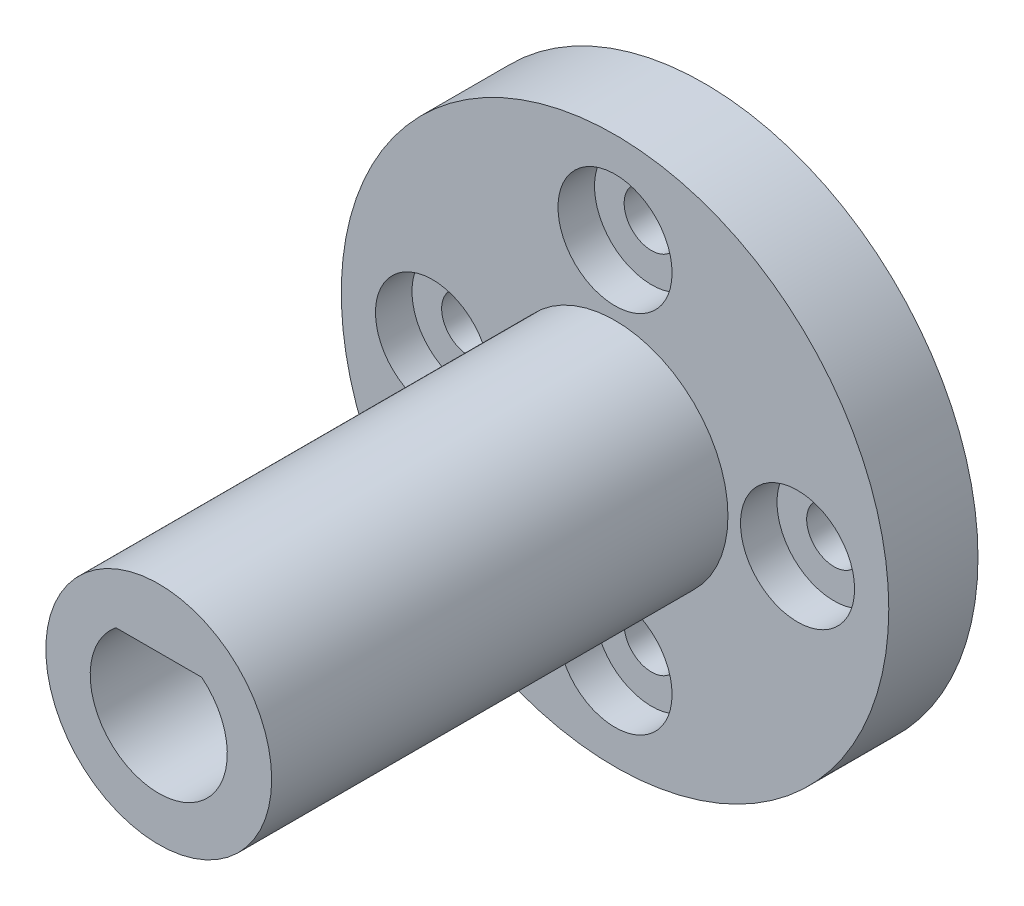
ISO-10303-21;
HEADER;
FILE_DESCRIPTION(('STEP AP214'),'2;1');
FILE_NAME('part.step','',(''),(''),'','','');
FILE_SCHEMA(('AUTOMOTIVE_DESIGN { 1 0 10303 214 1 1 1 1 }'));
ENDSEC;
DATA;
#1=APPLICATION_CONTEXT('core data for automotive mechanical design processes');
#2=APPLICATION_PROTOCOL_DEFINITION('international standard','automotive_design',2000,#1);
#3=PRODUCT_CONTEXT('',#1,'mechanical');
#4=PRODUCT('Part','Part','',(#3));
#5=PRODUCT_RELATED_PRODUCT_CATEGORY('part','',(#4));
#6=PRODUCT_DEFINITION_FORMATION('','',#4);
#7=PRODUCT_DEFINITION_CONTEXT('part definition',#1,'design');
#8=PRODUCT_DEFINITION('design','',#6,#7);
#9=PRODUCT_DEFINITION_SHAPE('','',#8);
#10=(LENGTH_UNIT() NAMED_UNIT(*) SI_UNIT(.MILLI.,.METRE.));
#11=(NAMED_UNIT(*) PLANE_ANGLE_UNIT() SI_UNIT($,.RADIAN.));
#12=(NAMED_UNIT(*) SI_UNIT($,.STERADIAN.) SOLID_ANGLE_UNIT());
#13=UNCERTAINTY_MEASURE_WITH_UNIT(LENGTH_MEASURE(1.E-05),#10,'distance_accuracy_value','');
#14=(GEOMETRIC_REPRESENTATION_CONTEXT(3) GLOBAL_UNCERTAINTY_ASSIGNED_CONTEXT((#13)) GLOBAL_UNIT_ASSIGNED_CONTEXT((#10,
#11,#12)) REPRESENTATION_CONTEXT('',''));
#15=CARTESIAN_POINT('',(0.,0.,0.));
#16=DIRECTION('',(0.,0.,1.));
#17=DIRECTION('',(1.,0.,0.));
#18=AXIS2_PLACEMENT_3D('',#15,#16,#17);
#19=CARTESIAN_POINT('',(0.,0.,3.91));
#20=DIRECTION('',(0.,0.,-1.));
#21=DIRECTION('',(-1.,0.,0.));
#22=AXIS2_PLACEMENT_3D('',#19,#20,#21);
#23=CYLINDRICAL_SURFACE('',#22,12.);
#24=CARTESIAN_POINT('',(0.,0.,3.91));
#25=DIRECTION('',(0.,0.,1.));
#26=DIRECTION('',(1.,0.,0.));
#27=AXIS2_PLACEMENT_3D('',#24,#25,#26);
#28=CIRCLE('',#27,12.);
#29=CARTESIAN_POINT('',(12.,0.,3.91));
#30=VERTEX_POINT('',#29);
#31=EDGE_CURVE('E11',#30,#30,#28,.T.);
#32=ORIENTED_EDGE('',*,*,#31,.F.);
#33=EDGE_LOOP('',(#32));
#34=FACE_BOUND('',#33,.T.);
#35=CARTESIAN_POINT('',(0.,0.,0.));
#36=DIRECTION('',(0.,0.,1.));
#37=DIRECTION('',(1.,0.,0.));
#38=AXIS2_PLACEMENT_3D('',#35,#36,#37);
#39=CIRCLE('',#38,12.);
#40=CARTESIAN_POINT('',(12.,0.,0.));
#41=VERTEX_POINT('',#40);
#42=EDGE_CURVE('E40',#41,#41,#39,.T.);
#43=ORIENTED_EDGE('',*,*,#42,.T.);
#44=EDGE_LOOP('',(#43));
#45=FACE_BOUND('',#44,.T.);
#46=ADVANCED_FACE('F37',(#34,#45),#23,.T.);
#47=CARTESIAN_POINT('',(0.,0.,3.91));
#48=DIRECTION('',(0.,0.,1.));
#49=DIRECTION('',(1.,0.,0.));
#50=AXIS2_PLACEMENT_3D('',#47,#48,#49);
#51=PLANE('',#50);
#52=CARTESIAN_POINT('',(8.,0.,3.91));
#53=DIRECTION('',(0.,0.,1.));
#54=DIRECTION('',(1.,0.,0.));
#55=AXIS2_PLACEMENT_3D('',#52,#53,#54);
#56=CIRCLE('',#55,2.5);
#57=CARTESIAN_POINT('',(10.5,0.,3.91));
#58=VERTEX_POINT('',#57);
#59=EDGE_CURVE('E307',#58,#58,#56,.T.);
#60=ORIENTED_EDGE('',*,*,#59,.F.);
#61=EDGE_LOOP('',(#60));
#62=FACE_BOUND('',#61,.T.);
#63=CARTESIAN_POINT('',(0.,-8.,3.91));
#64=DIRECTION('',(0.,0.,1.));
#65=DIRECTION('',(1.,0.,0.));
#66=AXIS2_PLACEMENT_3D('',#63,#64,#65);
#67=CIRCLE('',#66,2.5);
#68=CARTESIAN_POINT('',(2.5,-8.,3.91));
#69=VERTEX_POINT('',#68);
#70=EDGE_CURVE('E317',#69,#69,#67,.T.);
#71=ORIENTED_EDGE('',*,*,#70,.F.);
#72=EDGE_LOOP('',(#71));
#73=FACE_BOUND('',#72,.T.);
#74=CARTESIAN_POINT('',(-8.,0.,3.91));
#75=DIRECTION('',(0.,0.,1.));
#76=DIRECTION('',(1.,0.,0.));
#77=AXIS2_PLACEMENT_3D('',#74,#75,#76);
#78=CIRCLE('',#77,2.5);
#79=CARTESIAN_POINT('',(-5.50000000000001,0.,3.91));
#80=VERTEX_POINT('',#79);
#81=EDGE_CURVE('E329',#80,#80,#78,.T.);
#82=ORIENTED_EDGE('',*,*,#81,.F.);
#83=EDGE_LOOP('',(#82));
#84=FACE_BOUND('',#83,.T.);
#85=CARTESIAN_POINT('',(0.,8.,3.91));
#86=DIRECTION('',(0.,0.,1.));
#87=DIRECTION('',(1.,0.,0.));
#88=AXIS2_PLACEMENT_3D('',#85,#86,#87);
#89=CIRCLE('',#88,2.5);
#90=CARTESIAN_POINT('',(2.5,8.,3.91));
#91=VERTEX_POINT('',#90);
#92=EDGE_CURVE('E341',#91,#91,#89,.T.);
#93=ORIENTED_EDGE('',*,*,#92,.F.);
#94=EDGE_LOOP('',(#93));
#95=FACE_BOUND('',#94,.T.);
#96=CARTESIAN_POINT('',(0.,0.,3.91));
#97=DIRECTION('',(0.,0.,1.));
#98=DIRECTION('',(1.,0.,0.));
#99=AXIS2_PLACEMENT_3D('',#96,#97,#98);
#100=CIRCLE('',#99,4.95);
#101=CARTESIAN_POINT('',(4.95,0.,3.91));
#102=VERTEX_POINT('',#101);
#103=EDGE_CURVE('E77',#102,#102,#100,.T.);
#104=ORIENTED_EDGE('',*,*,#103,.F.);
#105=EDGE_LOOP('',(#104));
#106=FACE_BOUND('',#105,.T.);
#107=ORIENTED_EDGE('',*,*,#31,.T.);
#108=EDGE_LOOP('',(#107));
#109=FACE_BOUND('',#108,.T.);
#110=ADVANCED_FACE('F96',(#62,#73,#84,#95,#106,#109),#51,.T.);
#111=CARTESIAN_POINT('',(0.,0.,0.));
#112=DIRECTION('',(0.,0.,1.));
#113=DIRECTION('',(1.,0.,0.));
#114=AXIS2_PLACEMENT_3D('',#111,#112,#113);
#115=PLANE('',#114);
#116=CARTESIAN_POINT('',(8.,0.,0.));
#117=DIRECTION('',(0.,0.,1.));
#118=DIRECTION('',(1.,0.,0.));
#119=AXIS2_PLACEMENT_3D('',#116,#117,#118);
#120=CIRCLE('',#119,1.2);
#121=CARTESIAN_POINT('',(9.2,0.,0.));
#122=VERTEX_POINT('',#121);
#123=EDGE_CURVE('E314',#122,#122,#120,.T.);
#124=ORIENTED_EDGE('',*,*,#123,.T.);
#125=EDGE_LOOP('',(#124));
#126=FACE_BOUND('',#125,.T.);
#127=CARTESIAN_POINT('',(0.,-8.,0.));
#128=DIRECTION('',(0.,0.,1.));
#129=DIRECTION('',(1.,0.,0.));
#130=AXIS2_PLACEMENT_3D('',#127,#128,#129);
#131=CIRCLE('',#130,1.2);
#132=CARTESIAN_POINT('',(1.2,-8.,0.));
#133=VERTEX_POINT('',#132);
#134=EDGE_CURVE('E326',#133,#133,#131,.T.);
#135=ORIENTED_EDGE('',*,*,#134,.T.);
#136=EDGE_LOOP('',(#135));
#137=FACE_BOUND('',#136,.T.);
#138=CARTESIAN_POINT('',(-8.,0.,0.));
#139=DIRECTION('',(0.,0.,1.));
#140=DIRECTION('',(1.,0.,0.));
#141=AXIS2_PLACEMENT_3D('',#138,#139,#140);
#142=CIRCLE('',#141,1.2);
#143=CARTESIAN_POINT('',(-6.8,0.,0.));
#144=VERTEX_POINT('',#143);
#145=EDGE_CURVE('E338',#144,#144,#142,.T.);
#146=ORIENTED_EDGE('',*,*,#145,.T.);
#147=EDGE_LOOP('',(#146));
#148=FACE_BOUND('',#147,.T.);
#149=CARTESIAN_POINT('',(0.,8.,0.));
#150=DIRECTION('',(0.,0.,1.));
#151=DIRECTION('',(1.,0.,0.));
#152=AXIS2_PLACEMENT_3D('',#149,#150,#151);
#153=CIRCLE('',#152,1.2);
#154=CARTESIAN_POINT('',(1.2,8.,0.));
#155=VERTEX_POINT('',#154);
#156=EDGE_CURVE('E67',#155,#155,#153,.T.);
#157=ORIENTED_EDGE('',*,*,#156,.T.);
#158=EDGE_LOOP('',(#157));
#159=FACE_BOUND('',#158,.T.);
#160=CARTESIAN_POINT('',(0.,0.,0.));
#161=DIRECTION('',(0.,0.,-1.));
#162=DIRECTION('',(-1.,0.,0.));
#163=AXIS2_PLACEMENT_3D('',#160,#161,#162);
#164=CIRCLE('',#163,4.);
#165=CARTESIAN_POINT('',(-4.,0.,0.));
#166=VERTEX_POINT('',#165);
#167=EDGE_CURVE('E84',#166,#166,#164,.T.);
#168=ORIENTED_EDGE('',*,*,#167,.F.);
#169=EDGE_LOOP('',(#168));
#170=FACE_BOUND('',#169,.T.);
#171=ORIENTED_EDGE('',*,*,#42,.F.);
#172=EDGE_LOOP('',(#171));
#173=FACE_BOUND('',#172,.T.);
#174=ADVANCED_FACE('F93',(#126,#137,#148,#159,#170,#173),#115,.F.);
#175=CARTESIAN_POINT('',(0.,0.,1.91));
#176=DIRECTION('',(0.,0.,-1.));
#177=DIRECTION('',(-1.,0.,0.));
#178=AXIS2_PLACEMENT_3D('',#175,#176,#177);
#179=CYLINDRICAL_SURFACE('',#178,4.);
#180=CARTESIAN_POINT('',(0.,0.,1.91));
#181=DIRECTION('',(0.,0.,-1.));
#182=DIRECTION('',(-1.,0.,0.));
#183=AXIS2_PLACEMENT_3D('',#180,#181,#182);
#184=CIRCLE('',#183,4.);
#185=CARTESIAN_POINT('',(-4.,0.,1.91));
#186=VERTEX_POINT('',#185);
#187=EDGE_CURVE('E85',#186,#186,#184,.T.);
#188=CARTESIAN_POINT('',(-4.,0.,1.91));
#189=CARTESIAN_POINT('',(-4.,0.,1.89010416666667));
#190=CARTESIAN_POINT('',(-4.,0.,1.87020833333333));
#191=CARTESIAN_POINT('',(-4.,0.,1.83041666666667));
#192=CARTESIAN_POINT('',(-4.,0.,1.81052083333333));
#193=CARTESIAN_POINT('',(-4.,0.,1.77072916666667));
#194=CARTESIAN_POINT('',(-4.,0.,1.75083333333333));
#195=CARTESIAN_POINT('',(-4.,0.,1.71104166666667));
#196=CARTESIAN_POINT('',(-4.,0.,1.69114583333333));
#197=CARTESIAN_POINT('',(-4.,0.,1.65135416666667));
#198=CARTESIAN_POINT('',(-4.,0.,1.63145833333333));
#199=CARTESIAN_POINT('',(-4.,0.,1.59166666666667));
#200=CARTESIAN_POINT('',(-4.,0.,1.57177083333333));
#201=CARTESIAN_POINT('',(-4.,0.,1.53197916666667));
#202=CARTESIAN_POINT('',(-4.,0.,1.51208333333333));
#203=CARTESIAN_POINT('',(-4.,0.,1.47229166666667));
#204=CARTESIAN_POINT('',(-4.,0.,1.45239583333333));
#205=CARTESIAN_POINT('',(-4.,0.,1.41260416666667));
#206=CARTESIAN_POINT('',(-4.,0.,1.39270833333333));
#207=CARTESIAN_POINT('',(-4.,0.,1.35291666666667));
#208=CARTESIAN_POINT('',(-4.,0.,1.33302083333333));
#209=CARTESIAN_POINT('',(-4.,0.,1.29322916666667));
#210=CARTESIAN_POINT('',(-4.,0.,1.27333333333333));
#211=CARTESIAN_POINT('',(-4.,0.,1.23354166666667));
#212=CARTESIAN_POINT('',(-4.,0.,1.21364583333333));
#213=CARTESIAN_POINT('',(-4.,0.,1.17385416666667));
#214=CARTESIAN_POINT('',(-4.,0.,1.15395833333333));
#215=CARTESIAN_POINT('',(-4.,0.,1.11416666666667));
#216=CARTESIAN_POINT('',(-4.,0.,1.09427083333333));
#217=CARTESIAN_POINT('',(-4.,0.,1.05447916666667));
#218=CARTESIAN_POINT('',(-4.,0.,1.03458333333333));
#219=CARTESIAN_POINT('',(-4.,0.,0.994791666666667));
#220=CARTESIAN_POINT('',(-4.,0.,0.974895833333334));
#221=CARTESIAN_POINT('',(-4.,0.,0.935104166666667));
#222=CARTESIAN_POINT('',(-4.,0.,0.915208333333333));
#223=CARTESIAN_POINT('',(-4.,0.,0.875416666666667));
#224=CARTESIAN_POINT('',(-4.,0.,0.855520833333333));
#225=CARTESIAN_POINT('',(-4.,0.,0.815729166666667));
#226=CARTESIAN_POINT('',(-4.,0.,0.795833333333333));
#227=CARTESIAN_POINT('',(-4.,0.,0.756041666666667));
#228=CARTESIAN_POINT('',(-4.,0.,0.736145833333333));
#229=CARTESIAN_POINT('',(-4.,0.,0.696354166666667));
#230=CARTESIAN_POINT('',(-4.,0.,0.676458333333333));
#231=CARTESIAN_POINT('',(-4.,0.,0.636666666666667));
#232=CARTESIAN_POINT('',(-4.,0.,0.616770833333333));
#233=CARTESIAN_POINT('',(-4.,0.,0.576979166666667));
#234=CARTESIAN_POINT('',(-4.,0.,0.557083333333333));
#235=CARTESIAN_POINT('',(-4.,0.,0.517291666666667));
#236=CARTESIAN_POINT('',(-4.,0.,0.497395833333333));
#237=CARTESIAN_POINT('',(-4.,0.,0.457604166666667));
#238=CARTESIAN_POINT('',(-4.,0.,0.437708333333333));
#239=CARTESIAN_POINT('',(-4.,0.,0.397916666666667));
#240=CARTESIAN_POINT('',(-4.,0.,0.378020833333333));
#241=CARTESIAN_POINT('',(-4.,0.,0.338229166666667));
#242=CARTESIAN_POINT('',(-4.,0.,0.318333333333333));
#243=CARTESIAN_POINT('',(-4.,0.,0.278541666666667));
#244=CARTESIAN_POINT('',(-4.,0.,0.258645833333333));
#245=CARTESIAN_POINT('',(-4.,0.,0.218854166666667));
#246=CARTESIAN_POINT('',(-4.,0.,0.198958333333333));
#247=CARTESIAN_POINT('',(-4.,0.,0.159166666666667));
#248=CARTESIAN_POINT('',(-4.,0.,0.139270833333333));
#249=CARTESIAN_POINT('',(-4.,0.,0.0994791666666668));
#250=CARTESIAN_POINT('',(-4.,0.,0.0795833333333334));
#251=CARTESIAN_POINT('',(-4.,0.,0.0397916666666667));
#252=CARTESIAN_POINT('',(-4.,0.,0.0198958333333334));
#253=CARTESIAN_POINT('',(-4.,0.,0.));
#254=B_SPLINE_CURVE_WITH_KNOTS('',3,(#188,#189,#190,#191,#192,#193,#194,#195,#196,#197,#198,
#199,#200,#201,#202,#203,#204,#205,#206,#207,#208,#209,#210,#211,#212,#213,#214,#215,#216,#217,
#218,#219,#220,#221,#222,#223,#224,#225,#226,#227,#228,#229,#230,#231,#232,#233,#234,#235,#236,
#237,#238,#239,#240,#241,#242,#243,#244,#245,#246,#247,#248,#249,#250,#251,#252,#253),
.UNSPECIFIED.,.F.,.F.,(4,2,2,2,2,2,2,2,2,2,2,2,2,2,2,2,2,2,2,2,2,2,2,2,2,2,2,2,2,2,2,2,4),(0.,
0.0596874999999998,0.119375,0.1790625,0.23875,0.2984375,0.358125,0.4178125,0.4775,0.5371875,
0.596875,0.6565625,0.71625,0.7759375,0.835625,0.8953125,0.955,1.0146875,1.074375,1.1340625,
1.19375,1.2534375,1.313125,1.3728125,1.4325,1.4921875,1.551875,1.6115625,1.67125,1.7309375,
1.790625,1.8503125,1.91),.UNSPECIFIED.);
#255=EDGE_CURVE('BSEAM91',#186,#166,#254,.T.);
#256=ORIENTED_EDGE('',*,*,#187,.F.);
#257=ORIENTED_EDGE('',*,*,#167,.T.);
#258=ORIENTED_EDGE('',*,*,#255,.T.);
#259=ORIENTED_EDGE('',*,*,#255,.F.);
#260=EDGE_LOOP('',(#256,#258,#257,#259));
#261=FACE_BOUND('',#260,.T.);
#262=ADVANCED_FACE('F91',(#261),#179,.F.);
#263=CARTESIAN_POINT('',(0.,0.,1.91));
#264=DIRECTION('',(0.,0.,-1.));
#265=DIRECTION('',(-1.,0.,0.));
#266=AXIS2_PLACEMENT_3D('',#263,#264,#265);
#267=PLANE('',#266);
#268=ORIENTED_EDGE('',*,*,#187,.T.);
#269=EDGE_LOOP('',(#268));
#270=FACE_BOUND('',#269,.T.);
#271=ADVANCED_FACE('F140',(#270),#267,.T.);
#272=CARTESIAN_POINT('',(0.,2.345,23.91));
#273=DIRECTION('',(0.,-1.,0.));
#274=DIRECTION('',(0.,0.,-1.));
#275=AXIS2_PLACEMENT_3D('',#272,#273,#274);
#276=PLANE('',#275);
#277=DIRECTION('',(-1.,0.,0.));
#278=VECTOR('',#277,1.);
#279=CARTESIAN_POINT('',(0.,2.345,3.91));
#280=LINE('',#279,#278);
#281=CARTESIAN_POINT('',(1.87909552710872,2.345,3.91));
#282=VERTEX_POINT('',#281);
#283=CARTESIAN_POINT('',(-1.87909552710872,2.345,3.91));
#284=VERTEX_POINT('',#283);
#285=EDGE_CURVE('E64',#282,#284,#280,.T.);
#286=ORIENTED_EDGE('',*,*,#285,.F.);
#287=DIRECTION('',(0.,0.,-1.));
#288=VECTOR('',#287,1.);
#289=CARTESIAN_POINT('',(1.87909552710872,2.345,23.91));
#290=LINE('',#289,#288);
#291=CARTESIAN_POINT('',(1.87909552710872,2.345,23.91));
#292=VERTEX_POINT('',#291);
#293=EDGE_CURVE('E73',#292,#282,#290,.T.);
#294=ORIENTED_EDGE('',*,*,#293,.F.);
#295=DIRECTION('',(-1.,0.,0.));
#296=VECTOR('',#295,1.);
#297=CARTESIAN_POINT('',(0.,2.345,23.91));
#298=LINE('',#297,#296);
#299=CARTESIAN_POINT('',(-1.87909552710872,2.345,23.91));
#300=VERTEX_POINT('',#299);
#301=EDGE_CURVE('E71',#292,#300,#298,.T.);
#302=ORIENTED_EDGE('',*,*,#301,.T.);
#303=DIRECTION('',(0.,0.,-1.));
#304=VECTOR('',#303,1.);
#305=CARTESIAN_POINT('',(-1.87909552710872,2.345,23.91));
#306=LINE('',#305,#304);
#307=EDGE_CURVE('E58',#300,#284,#306,.T.);
#308=ORIENTED_EDGE('',*,*,#307,.T.);
#309=EDGE_LOOP('',(#286,#294,#302,#308));
#310=FACE_BOUND('',#309,.T.);
#311=ADVANCED_FACE('F69',(#310),#276,.T.);
#312=CARTESIAN_POINT('',(0.,0.,23.91));
#313=DIRECTION('',(0.,0.,-1.));
#314=DIRECTION('',(-1.,0.,0.));
#315=AXIS2_PLACEMENT_3D('',#312,#313,#314);
#316=CYLINDRICAL_SURFACE('',#315,3.005);
#317=CARTESIAN_POINT('',(0.,0.,3.91));
#318=DIRECTION('',(0.,0.,1.));
#319=DIRECTION('',(1.,0.,0.));
#320=AXIS2_PLACEMENT_3D('',#317,#318,#319);
#321=CIRCLE('',#320,3.005);
#322=EDGE_CURVE('E50',#284,#282,#321,.T.);
#323=ORIENTED_EDGE('',*,*,#322,.F.);
#324=ORIENTED_EDGE('',*,*,#307,.F.);
#325=CARTESIAN_POINT('',(0.,0.,23.91));
#326=DIRECTION('',(0.,0.,1.));
#327=DIRECTION('',(1.,0.,0.));
#328=AXIS2_PLACEMENT_3D('',#325,#326,#327);
#329=CIRCLE('',#328,3.005);
#330=EDGE_CURVE('E353',#300,#292,#329,.T.);
#331=ORIENTED_EDGE('',*,*,#330,.T.);
#332=ORIENTED_EDGE('',*,*,#293,.T.);
#333=EDGE_LOOP('',(#323,#324,#331,#332));
#334=FACE_BOUND('',#333,.T.);
#335=ADVANCED_FACE('F76',(#334),#316,.F.);
#336=CARTESIAN_POINT('',(0.,0.,23.91));
#337=DIRECTION('',(0.,0.,-1.));
#338=DIRECTION('',(-1.,0.,0.));
#339=AXIS2_PLACEMENT_3D('',#336,#337,#338);
#340=CYLINDRICAL_SURFACE('',#339,4.95);
#341=CARTESIAN_POINT('',(0.,0.,23.91));
#342=DIRECTION('',(0.,0.,1.));
#343=DIRECTION('',(1.,0.,0.));
#344=AXIS2_PLACEMENT_3D('',#341,#342,#343);
#345=CIRCLE('',#344,4.95);
#346=CARTESIAN_POINT('',(4.95,0.,23.91));
#347=VERTEX_POINT('',#346);
#348=EDGE_CURVE('E74',#347,#347,#345,.T.);
#349=ORIENTED_EDGE('',*,*,#348,.F.);
#350=EDGE_LOOP('',(#349));
#351=FACE_BOUND('',#350,.T.);
#352=ORIENTED_EDGE('',*,*,#103,.T.);
#353=EDGE_LOOP('',(#352));
#354=FACE_BOUND('',#353,.T.);
#355=ADVANCED_FACE('F125',(#351,#354),#340,.T.);
#356=CARTESIAN_POINT('',(0.,0.,23.91));
#357=DIRECTION('',(0.,0.,1.));
#358=DIRECTION('',(1.,0.,0.));
#359=AXIS2_PLACEMENT_3D('',#356,#357,#358);
#360=PLANE('',#359);
#361=ORIENTED_EDGE('',*,*,#301,.F.);
#362=ORIENTED_EDGE('',*,*,#330,.F.);
#363=EDGE_LOOP('',(#361,#362));
#364=FACE_BOUND('',#363,.T.);
#365=ORIENTED_EDGE('',*,*,#348,.T.);
#366=EDGE_LOOP('',(#365));
#367=FACE_BOUND('',#366,.T.);
#368=ADVANCED_FACE('F117',(#364,#367),#360,.T.);
#369=ORIENTED_EDGE('',*,*,#285,.T.);
#370=ORIENTED_EDGE('',*,*,#322,.T.);
#371=EDGE_LOOP('',(#369,#370));
#372=FACE_BOUND('',#371,.T.);
#373=ADVANCED_FACE('F65',(#372),#51,.T.);
#374=CARTESIAN_POINT('',(0.,8.,3.91));
#375=DIRECTION('',(0.,0.,1.));
#376=DIRECTION('',(1.,0.,0.));
#377=AXIS2_PLACEMENT_3D('',#374,#375,#376);
#378=CYLINDRICAL_SURFACE('',#377,1.2);
#379=ORIENTED_EDGE('',*,*,#156,.F.);
#380=EDGE_LOOP('',(#379));
#381=FACE_BOUND('',#380,.T.);
#382=CARTESIAN_POINT('',(0.,8.,2.31));
#383=DIRECTION('',(0.,0.,1.));
#384=DIRECTION('',(1.,0.,0.));
#385=AXIS2_PLACEMENT_3D('',#382,#383,#384);
#386=CIRCLE('',#385,1.2);
#387=CARTESIAN_POINT('',(1.2,8.,2.31));
#388=VERTEX_POINT('',#387);
#389=EDGE_CURVE('E347',#388,#388,#386,.T.);
#390=ORIENTED_EDGE('',*,*,#389,.T.);
#391=EDGE_LOOP('',(#390));
#392=FACE_BOUND('',#391,.T.);
#393=ADVANCED_FACE('F116',(#381,#392),#378,.F.);
#394=CARTESIAN_POINT('',(1.2,8.,2.31));
#395=DIRECTION('',(0.,0.,-1.));
#396=DIRECTION('',(-1.,0.,0.));
#397=AXIS2_PLACEMENT_3D('',#394,#395,#396);
#398=PLANE('',#397);
#399=ORIENTED_EDGE('',*,*,#389,.F.);
#400=EDGE_LOOP('',(#399));
#401=FACE_BOUND('',#400,.T.);
#402=CARTESIAN_POINT('',(0.,8.,2.31));
#403=DIRECTION('',(0.,0.,1.));
#404=DIRECTION('',(1.,0.,0.));
#405=AXIS2_PLACEMENT_3D('',#402,#403,#404);
#406=CIRCLE('',#405,2.5);
#407=CARTESIAN_POINT('',(2.5,8.,2.31));
#408=VERTEX_POINT('',#407);
#409=EDGE_CURVE('E344',#408,#408,#406,.T.);
#410=ORIENTED_EDGE('',*,*,#409,.T.);
#411=EDGE_LOOP('',(#410));
#412=FACE_BOUND('',#411,.T.);
#413=ADVANCED_FACE('F122',(#401,#412),#398,.F.);
#414=CARTESIAN_POINT('',(0.,8.,3.91));
#415=DIRECTION('',(0.,0.,1.));
#416=DIRECTION('',(1.,0.,0.));
#417=AXIS2_PLACEMENT_3D('',#414,#415,#416);
#418=CYLINDRICAL_SURFACE('',#417,2.5);
#419=ORIENTED_EDGE('',*,*,#409,.F.);
#420=EDGE_LOOP('',(#419));
#421=FACE_BOUND('',#420,.T.);
#422=ORIENTED_EDGE('',*,*,#92,.T.);
#423=EDGE_LOOP('',(#422));
#424=FACE_BOUND('',#423,.T.);
#425=ADVANCED_FACE('F190',(#421,#424),#418,.F.);
#426=CARTESIAN_POINT('',(-8.,0.,3.91));
#427=DIRECTION('',(0.,0.,1.));
#428=DIRECTION('',(1.,0.,0.));
#429=AXIS2_PLACEMENT_3D('',#426,#427,#428);
#430=CYLINDRICAL_SURFACE('',#429,1.2);
#431=ORIENTED_EDGE('',*,*,#145,.F.);
#432=EDGE_LOOP('',(#431));
#433=FACE_BOUND('',#432,.T.);
#434=CARTESIAN_POINT('',(-8.,0.,2.31));
#435=DIRECTION('',(0.,0.,1.));
#436=DIRECTION('',(1.,0.,0.));
#437=AXIS2_PLACEMENT_3D('',#434,#435,#436);
#438=CIRCLE('',#437,1.2);
#439=CARTESIAN_POINT('',(-6.8,0.,2.31));
#440=VERTEX_POINT('',#439);
#441=EDGE_CURVE('E335',#440,#440,#438,.T.);
#442=ORIENTED_EDGE('',*,*,#441,.T.);
#443=EDGE_LOOP('',(#442));
#444=FACE_BOUND('',#443,.T.);
#445=ADVANCED_FACE('F198',(#433,#444),#430,.F.);
#446=CARTESIAN_POINT('',(-6.8,0.,2.31));
#447=DIRECTION('',(0.,0.,-1.));
#448=DIRECTION('',(-1.,0.,0.));
#449=AXIS2_PLACEMENT_3D('',#446,#447,#448);
#450=PLANE('',#449);
#451=ORIENTED_EDGE('',*,*,#441,.F.);
#452=EDGE_LOOP('',(#451));
#453=FACE_BOUND('',#452,.T.);
#454=CARTESIAN_POINT('',(-8.,0.,2.31));
#455=DIRECTION('',(0.,0.,1.));
#456=DIRECTION('',(1.,0.,0.));
#457=AXIS2_PLACEMENT_3D('',#454,#455,#456);
#458=CIRCLE('',#457,2.5);
#459=CARTESIAN_POINT('',(-5.5,0.,2.31));
#460=VERTEX_POINT('',#459);
#461=EDGE_CURVE('E332',#460,#460,#458,.T.);
#462=ORIENTED_EDGE('',*,*,#461,.T.);
#463=EDGE_LOOP('',(#462));
#464=FACE_BOUND('',#463,.T.);
#465=ADVANCED_FACE('F218',(#453,#464),#450,.F.);
#466=CARTESIAN_POINT('',(-8.,0.,3.91));
#467=DIRECTION('',(0.,0.,1.));
#468=DIRECTION('',(1.,0.,0.));
#469=AXIS2_PLACEMENT_3D('',#466,#467,#468);
#470=CYLINDRICAL_SURFACE('',#469,2.5);
#471=ORIENTED_EDGE('',*,*,#461,.F.);
#472=EDGE_LOOP('',(#471));
#473=FACE_BOUND('',#472,.T.);
#474=ORIENTED_EDGE('',*,*,#81,.T.);
#475=EDGE_LOOP('',(#474));
#476=FACE_BOUND('',#475,.T.);
#477=ADVANCED_FACE('F228',(#473,#476),#470,.F.);
#478=CARTESIAN_POINT('',(0.,-8.,3.91));
#479=DIRECTION('',(0.,0.,1.));
#480=DIRECTION('',(1.,0.,0.));
#481=AXIS2_PLACEMENT_3D('',#478,#479,#480);
#482=CYLINDRICAL_SURFACE('',#481,1.2);
#483=ORIENTED_EDGE('',*,*,#134,.F.);
#484=EDGE_LOOP('',(#483));
#485=FACE_BOUND('',#484,.T.);
#486=CARTESIAN_POINT('',(0.,-8.,2.31));
#487=DIRECTION('',(0.,0.,1.));
#488=DIRECTION('',(1.,0.,0.));
#489=AXIS2_PLACEMENT_3D('',#486,#487,#488);
#490=CIRCLE('',#489,1.2);
#491=CARTESIAN_POINT('',(1.2,-8.,2.31));
#492=VERTEX_POINT('',#491);
#493=EDGE_CURVE('E323',#492,#492,#490,.T.);
#494=ORIENTED_EDGE('',*,*,#493,.T.);
#495=EDGE_LOOP('',(#494));
#496=FACE_BOUND('',#495,.T.);
#497=ADVANCED_FACE('F238',(#485,#496),#482,.F.);
#498=CARTESIAN_POINT('',(1.2,-8.,2.31));
#499=DIRECTION('',(0.,0.,-1.));
#500=DIRECTION('',(-1.,0.,0.));
#501=AXIS2_PLACEMENT_3D('',#498,#499,#500);
#502=PLANE('',#501);
#503=ORIENTED_EDGE('',*,*,#493,.F.);
#504=EDGE_LOOP('',(#503));
#505=FACE_BOUND('',#504,.T.);
#506=CARTESIAN_POINT('',(0.,-8.,2.31));
#507=DIRECTION('',(0.,0.,1.));
#508=DIRECTION('',(1.,0.,0.));
#509=AXIS2_PLACEMENT_3D('',#506,#507,#508);
#510=CIRCLE('',#509,2.5);
#511=CARTESIAN_POINT('',(2.5,-8.,2.31));
#512=VERTEX_POINT('',#511);
#513=EDGE_CURVE('E320',#512,#512,#510,.T.);
#514=ORIENTED_EDGE('',*,*,#513,.T.);
#515=EDGE_LOOP('',(#514));
#516=FACE_BOUND('',#515,.T.);
#517=ADVANCED_FACE('F248',(#505,#516),#502,.F.);
#518=CARTESIAN_POINT('',(0.,-8.,3.91));
#519=DIRECTION('',(0.,0.,1.));
#520=DIRECTION('',(1.,0.,0.));
#521=AXIS2_PLACEMENT_3D('',#518,#519,#520);
#522=CYLINDRICAL_SURFACE('',#521,2.5);
#523=ORIENTED_EDGE('',*,*,#513,.F.);
#524=EDGE_LOOP('',(#523));
#525=FACE_BOUND('',#524,.T.);
#526=ORIENTED_EDGE('',*,*,#70,.T.);
#527=EDGE_LOOP('',(#526));
#528=FACE_BOUND('',#527,.T.);
#529=ADVANCED_FACE('F258',(#525,#528),#522,.F.);
#530=CARTESIAN_POINT('',(8.,0.,3.91));
#531=DIRECTION('',(0.,0.,1.));
#532=DIRECTION('',(1.,0.,0.));
#533=AXIS2_PLACEMENT_3D('',#530,#531,#532);
#534=CYLINDRICAL_SURFACE('',#533,1.2);
#535=ORIENTED_EDGE('',*,*,#123,.F.);
#536=EDGE_LOOP('',(#535));
#537=FACE_BOUND('',#536,.T.);
#538=CARTESIAN_POINT('',(8.,0.,2.31));
#539=DIRECTION('',(0.,0.,1.));
#540=DIRECTION('',(1.,0.,0.));
#541=AXIS2_PLACEMENT_3D('',#538,#539,#540);
#542=CIRCLE('',#541,1.2);
#543=CARTESIAN_POINT('',(9.2,0.,2.31));
#544=VERTEX_POINT('',#543);
#545=EDGE_CURVE('E309',#544,#544,#542,.T.);
#546=ORIENTED_EDGE('',*,*,#545,.T.);
#547=EDGE_LOOP('',(#546));
#548=FACE_BOUND('',#547,.T.);
#549=ADVANCED_FACE('F268',(#537,#548),#534,.F.);
#550=CARTESIAN_POINT('',(9.2,0.,2.31));
#551=DIRECTION('',(0.,0.,-1.));
#552=DIRECTION('',(-1.,0.,0.));
#553=AXIS2_PLACEMENT_3D('',#550,#551,#552);
#554=PLANE('',#553);
#555=ORIENTED_EDGE('',*,*,#545,.F.);
#556=EDGE_LOOP('',(#555));
#557=FACE_BOUND('',#556,.T.);
#558=CARTESIAN_POINT('',(8.,0.,2.31));
#559=DIRECTION('',(0.,0.,1.));
#560=DIRECTION('',(1.,0.,0.));
#561=AXIS2_PLACEMENT_3D('',#558,#559,#560);
#562=CIRCLE('',#561,2.5);
#563=CARTESIAN_POINT('',(10.5,0.,2.31));
#564=VERTEX_POINT('',#563);
#565=EDGE_CURVE('E305',#564,#564,#562,.T.);
#566=ORIENTED_EDGE('',*,*,#565,.T.);
#567=EDGE_LOOP('',(#566));
#568=FACE_BOUND('',#567,.T.);
#569=ADVANCED_FACE('F278',(#557,#568),#554,.F.);
#570=CARTESIAN_POINT('',(8.,0.,3.91));
#571=DIRECTION('',(0.,0.,1.));
#572=DIRECTION('',(1.,0.,0.));
#573=AXIS2_PLACEMENT_3D('',#570,#571,#572);
#574=CYLINDRICAL_SURFACE('',#573,2.5);
#575=ORIENTED_EDGE('',*,*,#565,.F.);
#576=EDGE_LOOP('',(#575));
#577=FACE_BOUND('',#576,.T.);
#578=ORIENTED_EDGE('',*,*,#59,.T.);
#579=EDGE_LOOP('',(#578));
#580=FACE_BOUND('',#579,.T.);
#581=ADVANCED_FACE('F288',(#577,#580),#574,.F.);
#582=CLOSED_SHELL('',(#46,#110,#174,#262,#271,#311,#335,#355,#368,#373,#393,#413,#425,#445,#465,
#477,#497,#517,#529,#549,#569,#581));
#583=MANIFOLD_SOLID_BREP('B2',#582);
#584=ADVANCED_BREP_SHAPE_REPRESENTATION('',(#18,#583),#14);
#585=SHAPE_DEFINITION_REPRESENTATION(#9,#584);
ENDSEC;
END-ISO-10303-21;
